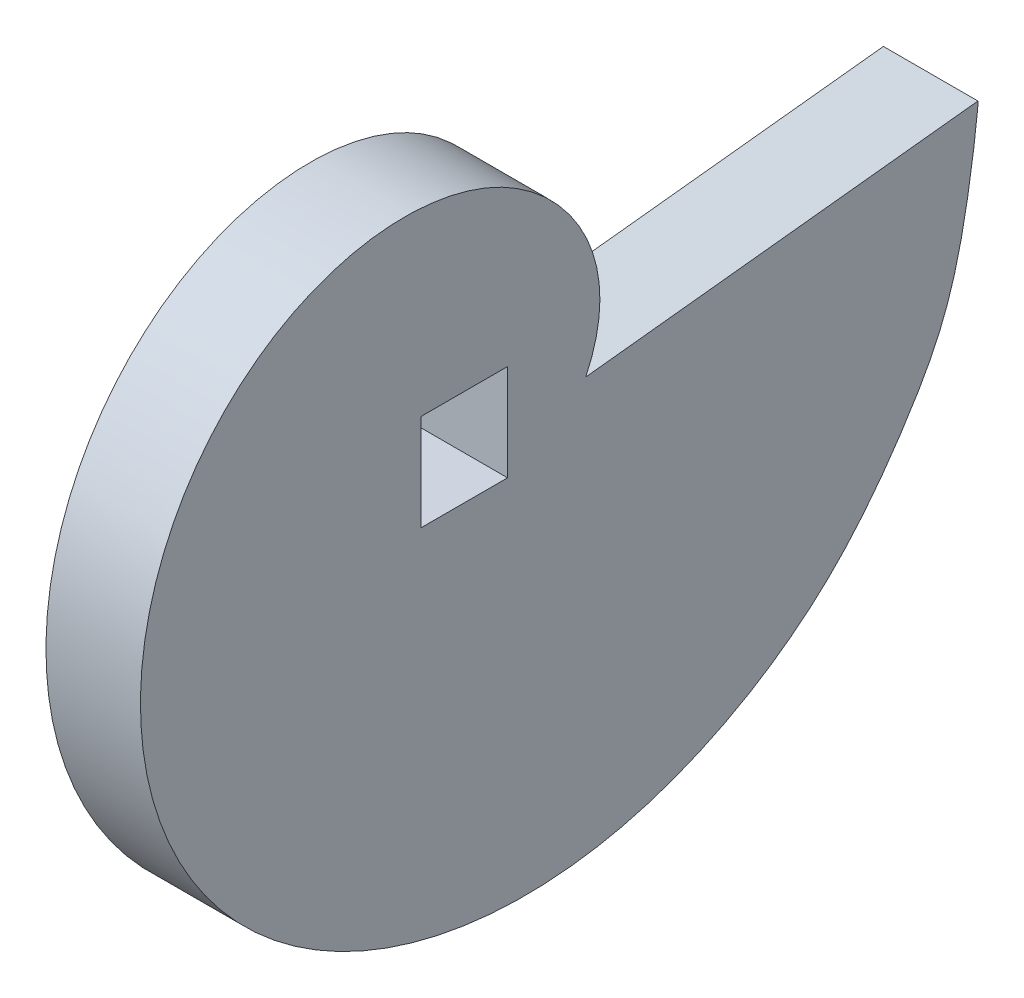
ISO-10303-21;
HEADER;
FILE_DESCRIPTION(('STEP AP214'),'2;1');
FILE_NAME('part.step','',(''),(''),'','','');
FILE_SCHEMA(('AUTOMOTIVE_DESIGN { 1 0 10303 214 1 1 1 1 }'));
ENDSEC;
DATA;
#1=APPLICATION_CONTEXT('core data for automotive mechanical design processes');
#2=APPLICATION_PROTOCOL_DEFINITION('international standard','automotive_design',2000,#1);
#3=PRODUCT_CONTEXT('',#1,'mechanical');
#4=PRODUCT('Part','Part','',(#3));
#5=PRODUCT_RELATED_PRODUCT_CATEGORY('part','',(#4));
#6=PRODUCT_DEFINITION_FORMATION('','',#4);
#7=PRODUCT_DEFINITION_CONTEXT('part definition',#1,'design');
#8=PRODUCT_DEFINITION('design','',#6,#7);
#9=PRODUCT_DEFINITION_SHAPE('','',#8);
#10=(LENGTH_UNIT() NAMED_UNIT(*) SI_UNIT(.MILLI.,.METRE.));
#11=(NAMED_UNIT(*) PLANE_ANGLE_UNIT() SI_UNIT($,.RADIAN.));
#12=(NAMED_UNIT(*) SI_UNIT($,.STERADIAN.) SOLID_ANGLE_UNIT());
#13=UNCERTAINTY_MEASURE_WITH_UNIT(LENGTH_MEASURE(1.E-05),#10,'distance_accuracy_value','');
#14=(GEOMETRIC_REPRESENTATION_CONTEXT(3) GLOBAL_UNCERTAINTY_ASSIGNED_CONTEXT((#13)) GLOBAL_UNIT_ASSIGNED_CONTEXT((#10,
#11,#12)) REPRESENTATION_CONTEXT('',''));
#15=CARTESIAN_POINT('',(0.,0.,0.));
#16=DIRECTION('',(0.,0.,1.));
#17=DIRECTION('',(1.,0.,0.));
#18=AXIS2_PLACEMENT_3D('',#15,#16,#17);
#19=CARTESIAN_POINT('',(7.,-0.974744023999251,-0.106837803167532));
#20=DIRECTION('',(0.,0.994046846472231,0.108953508519061));
#21=DIRECTION('',(0.,-0.108953508519061,0.994046846472231));
#22=AXIS2_PLACEMENT_3D('',#19,#20,#21);
#23=PLANE('',#22);
#24=DIRECTION('',(0.,0.108953508519061,-0.994046846472231));
#25=VECTOR('',#24,1.);
#26=CARTESIAN_POINT('',(0.,-0.974744023999251,-0.106837803167532));
#27=LINE('',#26,#25);
#28=CARTESIAN_POINT('',(0.,0.,-9.00000000000123));
#29=VERTEX_POINT('',#28);
#30=CARTESIAN_POINT('',(0.,3.18413921515921,-38.0507721006891));
#31=VERTEX_POINT('',#30);
#32=EDGE_CURVE('E167',#29,#31,#27,.T.);
#33=ORIENTED_EDGE('',*,*,#32,.F.);
#34=DIRECTION('',(-1.,0.,0.));
#35=VECTOR('',#34,1.);
#36=CARTESIAN_POINT('',(7.,0.,-9.00000000000123));
#37=LINE('',#36,#35);
#38=CARTESIAN_POINT('',(7.,0.,-9.00000000000123));
#39=VERTEX_POINT('',#38);
#40=EDGE_CURVE('E11',#39,#29,#37,.T.);
#41=ORIENTED_EDGE('',*,*,#40,.F.);
#42=DIRECTION('',(0.,0.108953508519061,-0.994046846472231));
#43=VECTOR('',#42,1.);
#44=CARTESIAN_POINT('',(7.,-0.974744023999251,-0.106837803167532));
#45=LINE('',#44,#43);
#46=CARTESIAN_POINT('',(7.,3.18413921515921,-38.0507721006891));
#47=VERTEX_POINT('',#46);
#48=EDGE_CURVE('E121',#39,#47,#45,.T.);
#49=ORIENTED_EDGE('',*,*,#48,.T.);
#50=DIRECTION('',(-1.,0.,0.));
#51=VECTOR('',#50,1.);
#52=CARTESIAN_POINT('',(7.,3.18413921515921,-38.0507721006891));
#53=LINE('',#52,#51);
#54=EDGE_CURVE('E51',#47,#31,#53,.T.);
#55=ORIENTED_EDGE('',*,*,#54,.T.);
#56=EDGE_LOOP('',(#33,#41,#49,#55));
#57=FACE_BOUND('',#56,.T.);
#58=ADVANCED_FACE('F41',(#57),#23,.T.);
#59=CARTESIAN_POINT('',(7.,0.,3.20837296414348));
#60=DIRECTION('',(0.,0.,-1.));
#61=DIRECTION('',(-1.,0.,0.));
#62=AXIS2_PLACEMENT_3D('',#59,#60,#61);
#63=PLANE('',#62);
#64=DIRECTION('',(0.,-1.,0.));
#65=VECTOR('',#64,1.);
#66=CARTESIAN_POINT('',(0.,0.,3.20837296414348));
#67=LINE('',#66,#65);
#68=CARTESIAN_POINT('',(0.,3.57020208432874,3.20837296414348));
#69=VERTEX_POINT('',#68);
#70=CARTESIAN_POINT('',(0.,-3.57020208432874,3.20837296414348));
#71=VERTEX_POINT('',#70);
#72=EDGE_CURVE('E131',#69,#71,#67,.T.);
#73=ORIENTED_EDGE('',*,*,#72,.F.);
#74=DIRECTION('',(-1.,0.,0.));
#75=VECTOR('',#74,1.);
#76=CARTESIAN_POINT('',(7.,3.57020208432874,3.20837296414348));
#77=LINE('',#76,#75);
#78=CARTESIAN_POINT('',(7.,3.57020208432874,3.20837296414348));
#79=VERTEX_POINT('',#78);
#80=EDGE_CURVE('E45',#79,#69,#77,.T.);
#81=ORIENTED_EDGE('',*,*,#80,.F.);
#82=DIRECTION('',(0.,-1.,0.));
#83=VECTOR('',#82,1.);
#84=CARTESIAN_POINT('',(7.,0.,3.20837296414348));
#85=LINE('',#84,#83);
#86=CARTESIAN_POINT('',(7.,-3.57020208432874,3.20837296414348));
#87=VERTEX_POINT('',#86);
#88=EDGE_CURVE('E112',#79,#87,#85,.T.);
#89=ORIENTED_EDGE('',*,*,#88,.T.);
#90=DIRECTION('',(-1.,0.,0.));
#91=VECTOR('',#90,1.);
#92=CARTESIAN_POINT('',(7.,-3.57020208432874,3.20837296414348));
#93=LINE('',#92,#91);
#94=EDGE_CURVE('E102',#87,#71,#93,.T.);
#95=ORIENTED_EDGE('',*,*,#94,.T.);
#96=EDGE_LOOP('',(#73,#81,#89,#95));
#97=FACE_BOUND('',#96,.T.);
#98=ADVANCED_FACE('F43',(#97),#63,.T.);
#99=CARTESIAN_POINT('',(7.,3.57020208432874,0.));
#100=DIRECTION('',(0.,1.,0.));
#101=DIRECTION('',(0.,0.,1.));
#102=AXIS2_PLACEMENT_3D('',#99,#100,#101);
#103=PLANE('',#102);
#104=DIRECTION('',(0.,0.,-1.));
#105=VECTOR('',#104,1.);
#106=CARTESIAN_POINT('',(0.,3.57020208432874,0.));
#107=LINE('',#106,#105);
#108=CARTESIAN_POINT('',(0.,3.57020208432874,-3.20837296414594));
#109=VERTEX_POINT('',#108);
#110=EDGE_CURVE('E158',#69,#109,#107,.T.);
#111=ORIENTED_EDGE('',*,*,#110,.T.);
#112=DIRECTION('',(-1.,0.,0.));
#113=VECTOR('',#112,1.);
#114=CARTESIAN_POINT('',(7.,3.57020208432874,-3.20837296414594));
#115=LINE('',#114,#113);
#116=CARTESIAN_POINT('',(7.,3.57020208432874,-3.20837296414594));
#117=VERTEX_POINT('',#116);
#118=EDGE_CURVE('E160',#117,#109,#115,.T.);
#119=ORIENTED_EDGE('',*,*,#118,.F.);
#120=DIRECTION('',(0.,0.,-1.));
#121=VECTOR('',#120,1.);
#122=CARTESIAN_POINT('',(7.,3.57020208432874,0.));
#123=LINE('',#122,#121);
#124=EDGE_CURVE('E114',#79,#117,#123,.T.);
#125=ORIENTED_EDGE('',*,*,#124,.F.);
#126=ORIENTED_EDGE('',*,*,#80,.T.);
#127=EDGE_LOOP('',(#111,#119,#125,#126));
#128=FACE_BOUND('',#127,.T.);
#129=ADVANCED_FACE('F149',(#128),#103,.F.);
#130=CARTESIAN_POINT('',(7.,0.,-3.20837296414594));
#131=DIRECTION('',(0.,0.,-1.));
#132=DIRECTION('',(-1.,0.,0.));
#133=AXIS2_PLACEMENT_3D('',#130,#131,#132);
#134=PLANE('',#133);
#135=DIRECTION('',(0.,-1.,0.));
#136=VECTOR('',#135,1.);
#137=CARTESIAN_POINT('',(0.,0.,-3.20837296414594));
#138=LINE('',#137,#136);
#139=CARTESIAN_POINT('',(0.,-3.57020208432874,-3.20837296414594));
#140=VERTEX_POINT('',#139);
#141=EDGE_CURVE('E163',#109,#140,#138,.T.);
#142=ORIENTED_EDGE('',*,*,#141,.T.);
#143=DIRECTION('',(-1.,0.,0.));
#144=VECTOR('',#143,1.);
#145=CARTESIAN_POINT('',(7.,-3.57020208432874,-3.20837296414594));
#146=LINE('',#145,#144);
#147=CARTESIAN_POINT('',(7.,-3.57020208432874,-3.20837296414594));
#148=VERTEX_POINT('',#147);
#149=EDGE_CURVE('E109',#148,#140,#146,.T.);
#150=ORIENTED_EDGE('',*,*,#149,.F.);
#151=DIRECTION('',(0.,-1.,0.));
#152=VECTOR('',#151,1.);
#153=CARTESIAN_POINT('',(7.,0.,-3.20837296414594));
#154=LINE('',#153,#152);
#155=EDGE_CURVE('E119',#117,#148,#154,.T.);
#156=ORIENTED_EDGE('',*,*,#155,.F.);
#157=ORIENTED_EDGE('',*,*,#118,.T.);
#158=EDGE_LOOP('',(#142,#150,#156,#157));
#159=FACE_BOUND('',#158,.T.);
#160=ADVANCED_FACE('F147',(#159),#134,.F.);
#161=CARTESIAN_POINT('',(7.,-3.57020208432874,0.));
#162=DIRECTION('',(0.,1.,0.));
#163=DIRECTION('',(0.,0.,1.));
#164=AXIS2_PLACEMENT_3D('',#161,#162,#163);
#165=PLANE('',#164);
#166=DIRECTION('',(0.,0.,-1.));
#167=VECTOR('',#166,1.);
#168=CARTESIAN_POINT('',(0.,-3.57020208432874,0.));
#169=LINE('',#168,#167);
#170=EDGE_CURVE('E107',#71,#140,#169,.T.);
#171=ORIENTED_EDGE('',*,*,#170,.F.);
#172=ORIENTED_EDGE('',*,*,#94,.F.);
#173=DIRECTION('',(0.,0.,-1.));
#174=VECTOR('',#173,1.);
#175=CARTESIAN_POINT('',(7.,-3.57020208432874,0.));
#176=LINE('',#175,#174);
#177=EDGE_CURVE('E105',#87,#148,#176,.T.);
#178=ORIENTED_EDGE('',*,*,#177,.T.);
#179=ORIENTED_EDGE('',*,*,#149,.T.);
#180=EDGE_LOOP('',(#171,#172,#178,#179));
#181=FACE_BOUND('',#180,.T.);
#182=ADVANCED_FACE('F103',(#181),#165,.T.);
#183=CARTESIAN_POINT('',(7.,0.,-9.00000000000123));
#184=CARTESIAN_POINT('',(7.,6.25946750886823,-12.019660327106));
#185=CARTESIAN_POINT('',(7.,15.7990844669241,-6.14265986113118));
#186=CARTESIAN_POINT('',(7.,17.6735864775406,6.33620296962038));
#187=CARTESIAN_POINT('',(7.,14.3532171555242,15.0842206803163));
#188=CARTESIAN_POINT('',(7.,7.52577373294626,21.3906392321013));
#189=CARTESIAN_POINT('',(7.,-1.22737831065702,24.3622592027506));
#190=CARTESIAN_POINT('',(7.,-10.4220522844866,23.817499081262));
#191=CARTESIAN_POINT('',(7.,-18.8095483624339,20.0746076146645));
#192=CARTESIAN_POINT('',(7.,-25.4587252299861,13.7678025517207));
#193=CARTESIAN_POINT('',(7.,-29.7690990457127,5.69825728202414));
#194=CARTESIAN_POINT('',(7.,-31.4435681809562,-3.28169694270372));
#195=CARTESIAN_POINT('',(7.,-30.4693544852295,-12.3519060905532));
#196=CARTESIAN_POINT('',(7.,-26.9816199410086,-20.7883640623701));
#197=CARTESIAN_POINT('',(7.,-21.5277285679162,-27.9792685087537));
#198=CARTESIAN_POINT('',(7.,-13.8283728067642,-33.5205627609818));
#199=CARTESIAN_POINT('',(7.,-6.04897594721914,-37.5044445542779));
#200=CARTESIAN_POINT('',(7.,8.58021684299529,-38.6681068767578));
#201=CARTESIAN_POINT('',(7.,-1.26229111046862,-37.3584879398581));
#202=B_SPLINE_CURVE_WITH_KNOTS('',3,(#183,#184,#185,#186,#187,#188,#189,#190,#191,#192,#193,
#194,#195,#196,#197,#198,#199,#200,#201),.UNSPECIFIED.,.F.,.F.,(4,1,1,1,1,1,1,1,1,1,1,1,1,1,1,1,
4),(0.,0.114285714285714,0.171428571428571,0.228571428571429,0.285714285714286,
0.342857142857143,0.4,0.457142857142857,0.514285714285714,0.571428571428571,0.628571428571428,
0.685714285714286,0.742857142857143,0.8,0.857142857142857,0.914285714285714,1.),.UNSPECIFIED.);
#203=DIRECTION('',(-1.,0.,0.));
#204=VECTOR('',#203,1.);
#205=SURFACE_OF_LINEAR_EXTRUSION('',#202,#204);
#206=CARTESIAN_POINT('',(0.,0.,-9.00000000000123));
#207=CARTESIAN_POINT('',(0.,6.25946750886823,-12.019660327106));
#208=CARTESIAN_POINT('',(0.,15.7990844669241,-6.14265986113118));
#209=CARTESIAN_POINT('',(0.,17.6735864775406,6.33620296962038));
#210=CARTESIAN_POINT('',(0.,14.3532171555242,15.0842206803163));
#211=CARTESIAN_POINT('',(0.,7.52577373294626,21.3906392321013));
#212=CARTESIAN_POINT('',(0.,-1.22737831065702,24.3622592027506));
#213=CARTESIAN_POINT('',(0.,-10.4220522844866,23.817499081262));
#214=CARTESIAN_POINT('',(0.,-18.8095483624339,20.0746076146645));
#215=CARTESIAN_POINT('',(0.,-25.4587252299861,13.7678025517207));
#216=CARTESIAN_POINT('',(0.,-29.7690990457127,5.69825728202414));
#217=CARTESIAN_POINT('',(0.,-31.4435681809562,-3.28169694270372));
#218=CARTESIAN_POINT('',(0.,-30.4693544852295,-12.3519060905532));
#219=CARTESIAN_POINT('',(0.,-26.9816199410086,-20.7883640623701));
#220=CARTESIAN_POINT('',(0.,-21.5277285679162,-27.9792685087537));
#221=CARTESIAN_POINT('',(0.,-13.8283728067642,-33.5205627609818));
#222=CARTESIAN_POINT('',(0.,-6.04897594721914,-37.5044445542779));
#223=CARTESIAN_POINT('',(0.,8.58021684299529,-38.6681068767578));
#224=CARTESIAN_POINT('',(0.,-1.26229111046862,-37.3584879398581));
#225=B_SPLINE_CURVE_WITH_KNOTS('',3,(#206,#207,#208,#209,#210,#211,#212,#213,#214,#215,#216,
#217,#218,#219,#220,#221,#222,#223,#224),.UNSPECIFIED.,.F.,.F.,(4,1,1,1,1,1,1,1,1,1,1,1,1,1,1,1,
4),(0.,0.114285714285714,0.171428571428571,0.228571428571429,0.285714285714286,
0.342857142857143,0.4,0.457142857142857,0.514285714285714,0.571428571428571,0.628571428571428,
0.685714285714286,0.742857142857143,0.8,0.857142857142857,0.914285714285714,1.),.UNSPECIFIED.);
#226=EDGE_CURVE('E115',#29,#31,#225,.T.);
#227=ORIENTED_EDGE('',*,*,#226,.T.);
#228=ORIENTED_EDGE('',*,*,#54,.F.);
#229=EDGE_CURVE('E59',#39,#47,#202,.T.);
#230=ORIENTED_EDGE('',*,*,#229,.F.);
#231=ORIENTED_EDGE('',*,*,#40,.T.);
#232=EDGE_LOOP('',(#227,#228,#230,#231));
#233=FACE_BOUND('',#232,.T.);
#234=ADVANCED_FACE('F137',(#233),#205,.F.);
#235=CARTESIAN_POINT('',(7.,0.,0.));
#236=DIRECTION('',(1.,0.,0.));
#237=DIRECTION('',(0.,0.,-1.));
#238=AXIS2_PLACEMENT_3D('',#235,#236,#237);
#239=PLANE('',#238);
#240=ORIENTED_EDGE('',*,*,#88,.F.);
#241=ORIENTED_EDGE('',*,*,#124,.T.);
#242=ORIENTED_EDGE('',*,*,#155,.T.);
#243=ORIENTED_EDGE('',*,*,#177,.F.);
#244=EDGE_LOOP('',(#240,#241,#242,#243));
#245=FACE_BOUND('',#244,.T.);
#246=ORIENTED_EDGE('',*,*,#48,.F.);
#247=ORIENTED_EDGE('',*,*,#229,.T.);
#248=EDGE_LOOP('',(#246,#247));
#249=FACE_BOUND('',#248,.T.);
#250=ADVANCED_FACE('F117',(#245,#249),#239,.T.);
#251=CARTESIAN_POINT('',(0.,0.,0.));
#252=DIRECTION('',(1.,0.,0.));
#253=DIRECTION('',(0.,0.,-1.));
#254=AXIS2_PLACEMENT_3D('',#251,#252,#253);
#255=PLANE('',#254);
#256=ORIENTED_EDGE('',*,*,#72,.T.);
#257=ORIENTED_EDGE('',*,*,#170,.T.);
#258=ORIENTED_EDGE('',*,*,#141,.F.);
#259=ORIENTED_EDGE('',*,*,#110,.F.);
#260=EDGE_LOOP('',(#256,#257,#258,#259));
#261=FACE_BOUND('',#260,.T.);
#262=ORIENTED_EDGE('',*,*,#32,.T.);
#263=ORIENTED_EDGE('',*,*,#226,.F.);
#264=EDGE_LOOP('',(#262,#263));
#265=FACE_BOUND('',#264,.T.);
#266=ADVANCED_FACE('F141',(#261,#265),#255,.F.);
#267=CLOSED_SHELL('',(#58,#98,#129,#160,#182,#234,#250,#266));
#268=MANIFOLD_SOLID_BREP('B2',#267);
#269=ADVANCED_BREP_SHAPE_REPRESENTATION('',(#18,#268),#14);
#270=SHAPE_DEFINITION_REPRESENTATION(#9,#269);
ENDSEC;
END-ISO-10303-21;
